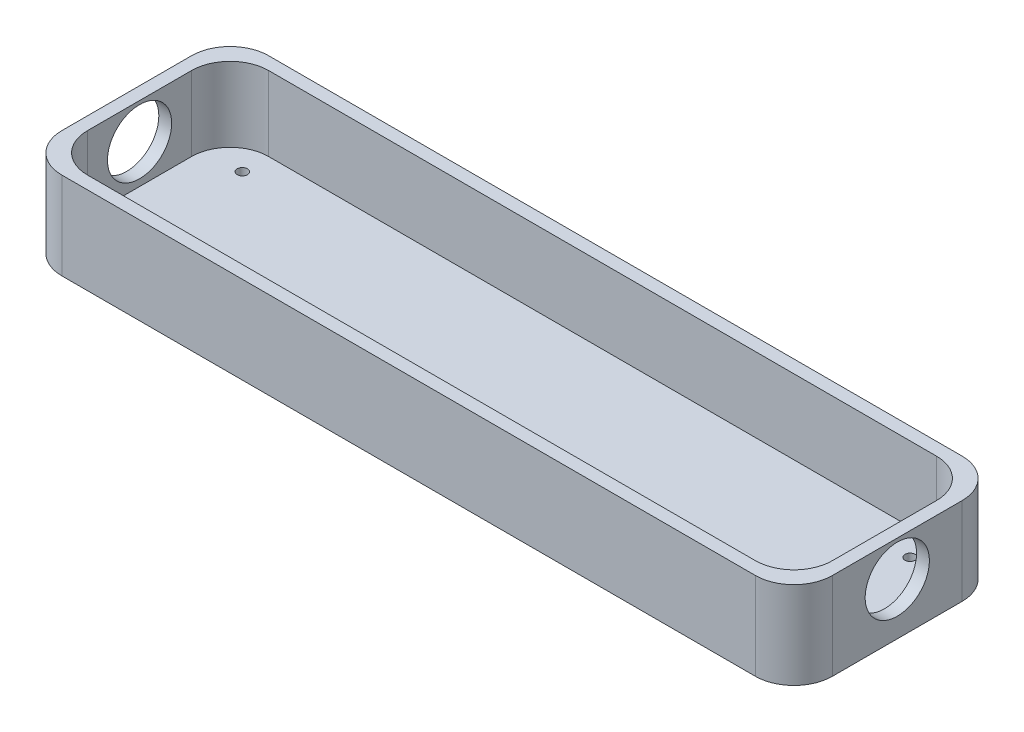
ISO-10303-21;
HEADER;
FILE_DESCRIPTION(('STEP AP214'),'2;1');
FILE_NAME('part.step','',(''),(''),'','','');
FILE_SCHEMA(('AUTOMOTIVE_DESIGN { 1 0 10303 214 1 1 1 1 }'));
ENDSEC;
DATA;
#1=APPLICATION_CONTEXT('core data for automotive mechanical design processes');
#2=APPLICATION_PROTOCOL_DEFINITION('international standard','automotive_design',2000,#1);
#3=PRODUCT_CONTEXT('',#1,'mechanical');
#4=PRODUCT('Part','Part','',(#3));
#5=PRODUCT_RELATED_PRODUCT_CATEGORY('part','',(#4));
#6=PRODUCT_DEFINITION_FORMATION('','',#4);
#7=PRODUCT_DEFINITION_CONTEXT('part definition',#1,'design');
#8=PRODUCT_DEFINITION('design','',#6,#7);
#9=PRODUCT_DEFINITION_SHAPE('','',#8);
#10=(LENGTH_UNIT() NAMED_UNIT(*) SI_UNIT(.MILLI.,.METRE.));
#11=(NAMED_UNIT(*) PLANE_ANGLE_UNIT() SI_UNIT($,.RADIAN.));
#12=(NAMED_UNIT(*) SI_UNIT($,.STERADIAN.) SOLID_ANGLE_UNIT());
#13=UNCERTAINTY_MEASURE_WITH_UNIT(LENGTH_MEASURE(1.E-05),#10,'distance_accuracy_value','');
#14=(GEOMETRIC_REPRESENTATION_CONTEXT(3) GLOBAL_UNCERTAINTY_ASSIGNED_CONTEXT((#13)) GLOBAL_UNIT_ASSIGNED_CONTEXT((#10,
#11,#12)) REPRESENTATION_CONTEXT('',''));
#15=CARTESIAN_POINT('',(0.,0.,0.));
#16=DIRECTION('',(0.,0.,1.));
#17=DIRECTION('',(1.,0.,0.));
#18=AXIS2_PLACEMENT_3D('',#15,#16,#17);
#19=CARTESIAN_POINT('',(130.,34.,20.25));
#20=DIRECTION('',(0.,-1.,0.));
#21=DIRECTION('',(0.,0.,-1.));
#22=AXIS2_PLACEMENT_3D('',#19,#20,#21);
#23=CYLINDRICAL_SURFACE('',#22,15.);
#24=DIRECTION('',(0.,1.,0.));
#25=VECTOR('',#24,1.);
#26=CARTESIAN_POINT('',(145.,34.,20.25));
#27=LINE('',#26,#25);
#28=CARTESIAN_POINT('',(145.,5.,20.25));
#29=VERTEX_POINT('',#28);
#30=CARTESIAN_POINT('',(145.,34.,20.25));
#31=VERTEX_POINT('',#30);
#32=EDGE_CURVE('E245',#29,#31,#27,.T.);
#33=ORIENTED_EDGE('',*,*,#32,.F.);
#34=CARTESIAN_POINT('',(130.,5.,20.25));
#35=DIRECTION('',(0.,1.,0.));
#36=DIRECTION('',(0.,0.,1.));
#37=AXIS2_PLACEMENT_3D('',#34,#35,#36);
#38=CIRCLE('',#37,15.);
#39=CARTESIAN_POINT('',(130.,5.,35.25));
#40=VERTEX_POINT('',#39);
#41=EDGE_CURVE('E40',#40,#29,#38,.T.);
#42=ORIENTED_EDGE('',*,*,#41,.F.);
#43=DIRECTION('',(0.,1.,0.));
#44=VECTOR('',#43,1.);
#45=CARTESIAN_POINT('',(130.,34.,35.25));
#46=LINE('',#45,#44);
#47=CARTESIAN_POINT('',(130.,34.,35.25));
#48=VERTEX_POINT('',#47);
#49=EDGE_CURVE('E248',#48,#40,#46,.F.);
#50=ORIENTED_EDGE('',*,*,#49,.F.);
#51=CARTESIAN_POINT('',(130.,34.,20.25));
#52=DIRECTION('',(0.,-1.,0.));
#53=DIRECTION('',(0.,0.,-1.));
#54=AXIS2_PLACEMENT_3D('',#51,#52,#53);
#55=CIRCLE('',#54,15.);
#56=EDGE_CURVE('E11',#48,#31,#55,.F.);
#57=ORIENTED_EDGE('',*,*,#56,.T.);
#58=EDGE_LOOP('',(#33,#42,#50,#57));
#59=FACE_BOUND('',#58,.T.);
#60=ADVANCED_FACE('F32',(#59),#23,.F.);
#61=CARTESIAN_POINT('',(130.,34.,-20.25));
#62=DIRECTION('',(0.,-1.,0.));
#63=DIRECTION('',(0.,0.,-1.));
#64=AXIS2_PLACEMENT_3D('',#61,#62,#63);
#65=CYLINDRICAL_SURFACE('',#64,15.);
#66=DIRECTION('',(0.,1.,0.));
#67=VECTOR('',#66,1.);
#68=CARTESIAN_POINT('',(130.,34.,-35.25));
#69=LINE('',#68,#67);
#70=CARTESIAN_POINT('',(130.,5.,-35.25));
#71=VERTEX_POINT('',#70);
#72=CARTESIAN_POINT('',(130.,34.,-35.25));
#73=VERTEX_POINT('',#72);
#74=EDGE_CURVE('E235',#71,#73,#69,.T.);
#75=ORIENTED_EDGE('',*,*,#74,.F.);
#76=CARTESIAN_POINT('',(130.,5.,-20.25));
#77=DIRECTION('',(0.,1.,0.));
#78=DIRECTION('',(0.,0.,1.));
#79=AXIS2_PLACEMENT_3D('',#76,#77,#78);
#80=CIRCLE('',#79,15.);
#81=CARTESIAN_POINT('',(145.,5.,-20.25));
#82=VERTEX_POINT('',#81);
#83=EDGE_CURVE('E241',#82,#71,#80,.T.);
#84=ORIENTED_EDGE('',*,*,#83,.F.);
#85=DIRECTION('',(0.,1.,0.));
#86=VECTOR('',#85,1.);
#87=CARTESIAN_POINT('',(145.,34.,-20.25));
#88=LINE('',#87,#86);
#89=CARTESIAN_POINT('',(145.,34.,-20.25));
#90=VERTEX_POINT('',#89);
#91=EDGE_CURVE('E238',#90,#82,#88,.F.);
#92=ORIENTED_EDGE('',*,*,#91,.F.);
#93=CARTESIAN_POINT('',(130.,34.,-20.25));
#94=DIRECTION('',(0.,-1.,0.));
#95=DIRECTION('',(0.,0.,-1.));
#96=AXIS2_PLACEMENT_3D('',#93,#94,#95);
#97=CIRCLE('',#96,15.);
#98=EDGE_CURVE('E243',#90,#73,#97,.F.);
#99=ORIENTED_EDGE('',*,*,#98,.T.);
#100=EDGE_LOOP('',(#75,#84,#92,#99));
#101=FACE_BOUND('',#100,.T.);
#102=ADVANCED_FACE('F339',(#101),#65,.F.);
#103=CARTESIAN_POINT('',(-130.,34.,20.25));
#104=DIRECTION('',(0.,-1.,0.));
#105=DIRECTION('',(0.,0.,-1.));
#106=AXIS2_PLACEMENT_3D('',#103,#104,#105);
#107=CYLINDRICAL_SURFACE('',#106,15.);
#108=DIRECTION('',(0.,1.,0.));
#109=VECTOR('',#108,1.);
#110=CARTESIAN_POINT('',(-130.,34.,35.25));
#111=LINE('',#110,#109);
#112=CARTESIAN_POINT('',(-130.,5.,35.25));
#113=VERTEX_POINT('',#112);
#114=CARTESIAN_POINT('',(-130.,34.,35.25));
#115=VERTEX_POINT('',#114);
#116=EDGE_CURVE('E225',#113,#115,#111,.T.);
#117=ORIENTED_EDGE('',*,*,#116,.F.);
#118=CARTESIAN_POINT('',(-130.,5.,20.25));
#119=DIRECTION('',(0.,1.,0.));
#120=DIRECTION('',(0.,0.,1.));
#121=AXIS2_PLACEMENT_3D('',#118,#119,#120);
#122=CIRCLE('',#121,15.);
#123=CARTESIAN_POINT('',(-145.,5.,20.25));
#124=VERTEX_POINT('',#123);
#125=EDGE_CURVE('E231',#124,#113,#122,.T.);
#126=ORIENTED_EDGE('',*,*,#125,.F.);
#127=DIRECTION('',(0.,1.,0.));
#128=VECTOR('',#127,1.);
#129=CARTESIAN_POINT('',(-145.,34.,20.25));
#130=LINE('',#129,#128);
#131=CARTESIAN_POINT('',(-145.,34.,20.25));
#132=VERTEX_POINT('',#131);
#133=EDGE_CURVE('E228',#132,#124,#130,.F.);
#134=ORIENTED_EDGE('',*,*,#133,.F.);
#135=CARTESIAN_POINT('',(-130.,34.,20.25));
#136=DIRECTION('',(0.,-1.,0.));
#137=DIRECTION('',(0.,0.,-1.));
#138=AXIS2_PLACEMENT_3D('',#135,#136,#137);
#139=CIRCLE('',#138,15.);
#140=EDGE_CURVE('E233',#132,#115,#139,.F.);
#141=ORIENTED_EDGE('',*,*,#140,.T.);
#142=EDGE_LOOP('',(#117,#126,#134,#141));
#143=FACE_BOUND('',#142,.T.);
#144=ADVANCED_FACE('F343',(#143),#107,.F.);
#145=CARTESIAN_POINT('',(-130.,34.,-20.25));
#146=DIRECTION('',(0.,1.,0.));
#147=DIRECTION('',(0.,0.,1.));
#148=AXIS2_PLACEMENT_3D('',#145,#146,#147);
#149=CYLINDRICAL_SURFACE('',#148,15.);
#150=DIRECTION('',(0.,-1.,0.));
#151=VECTOR('',#150,1.);
#152=CARTESIAN_POINT('',(-130.,34.,-35.25));
#153=LINE('',#152,#151);
#154=CARTESIAN_POINT('',(-130.,34.,-35.25));
#155=VERTEX_POINT('',#154);
#156=CARTESIAN_POINT('',(-130.,5.,-35.25));
#157=VERTEX_POINT('',#156);
#158=EDGE_CURVE('E214',#155,#157,#153,.T.);
#159=ORIENTED_EDGE('',*,*,#158,.F.);
#160=CARTESIAN_POINT('',(-130.,34.,-20.25));
#161=DIRECTION('',(0.,-1.,0.));
#162=DIRECTION('',(0.,0.,-1.));
#163=AXIS2_PLACEMENT_3D('',#160,#161,#162);
#164=CIRCLE('',#163,15.);
#165=CARTESIAN_POINT('',(-145.,34.,-20.25));
#166=VERTEX_POINT('',#165);
#167=EDGE_CURVE('E223',#155,#166,#164,.F.);
#168=ORIENTED_EDGE('',*,*,#167,.T.);
#169=DIRECTION('',(0.,-1.,0.));
#170=VECTOR('',#169,1.);
#171=CARTESIAN_POINT('',(-145.,34.,-20.25));
#172=LINE('',#171,#170);
#173=CARTESIAN_POINT('',(-145.,5.,-20.25));
#174=VERTEX_POINT('',#173);
#175=EDGE_CURVE('E217',#174,#166,#172,.F.);
#176=ORIENTED_EDGE('',*,*,#175,.F.);
#177=CARTESIAN_POINT('',(-130.,5.,-20.25));
#178=DIRECTION('',(0.,1.,0.));
#179=DIRECTION('',(0.,0.,1.));
#180=AXIS2_PLACEMENT_3D('',#177,#178,#179);
#181=CIRCLE('',#180,15.);
#182=EDGE_CURVE('E220',#157,#174,#181,.T.);
#183=ORIENTED_EDGE('',*,*,#182,.F.);
#184=EDGE_LOOP('',(#159,#168,#176,#183));
#185=FACE_BOUND('',#184,.T.);
#186=ADVANCED_FACE('F336',(#185),#149,.F.);
#187=CARTESIAN_POINT('',(135.,34.,25.25));
#188=DIRECTION('',(0.,-1.,0.));
#189=DIRECTION('',(0.,0.,-1.));
#190=AXIS2_PLACEMENT_3D('',#187,#188,#189);
#191=CYLINDRICAL_SURFACE('',#190,15.);
#192=DIRECTION('',(0.,-1.,0.));
#193=VECTOR('',#192,1.);
#194=CARTESIAN_POINT('',(150.,34.,25.25));
#195=LINE('',#194,#193);
#196=CARTESIAN_POINT('',(150.,34.,25.25));
#197=VERTEX_POINT('',#196);
#198=CARTESIAN_POINT('',(150.,0.,25.25));
#199=VERTEX_POINT('',#198);
#200=EDGE_CURVE('E206',#197,#199,#195,.T.);
#201=ORIENTED_EDGE('',*,*,#200,.F.);
#202=CARTESIAN_POINT('',(135.,34.,25.25));
#203=DIRECTION('',(0.,-1.,0.));
#204=DIRECTION('',(0.,0.,-1.));
#205=AXIS2_PLACEMENT_3D('',#202,#203,#204);
#206=CIRCLE('',#205,15.);
#207=CARTESIAN_POINT('',(135.,34.,40.25));
#208=VERTEX_POINT('',#207);
#209=EDGE_CURVE('E211',#208,#197,#206,.F.);
#210=ORIENTED_EDGE('',*,*,#209,.F.);
#211=DIRECTION('',(0.,-1.,0.));
#212=VECTOR('',#211,1.);
#213=CARTESIAN_POINT('',(135.,34.,40.25));
#214=LINE('',#213,#212);
#215=CARTESIAN_POINT('',(135.,0.,40.25));
#216=VERTEX_POINT('',#215);
#217=EDGE_CURVE('E209',#216,#208,#214,.F.);
#218=ORIENTED_EDGE('',*,*,#217,.F.);
#219=CARTESIAN_POINT('',(135.,0.,25.25));
#220=DIRECTION('',(0.,-1.,0.));
#221=DIRECTION('',(0.,0.,-1.));
#222=AXIS2_PLACEMENT_3D('',#219,#220,#221);
#223=CIRCLE('',#222,15.);
#224=EDGE_CURVE('E170',#199,#216,#223,.T.);
#225=ORIENTED_EDGE('',*,*,#224,.F.);
#226=EDGE_LOOP('',(#201,#210,#218,#225));
#227=FACE_BOUND('',#226,.T.);
#228=ADVANCED_FACE('F323',(#227),#191,.T.);
#229=CARTESIAN_POINT('',(135.,34.,-25.25));
#230=DIRECTION('',(0.,-1.,0.));
#231=DIRECTION('',(0.,0.,-1.));
#232=AXIS2_PLACEMENT_3D('',#229,#230,#231);
#233=CYLINDRICAL_SURFACE('',#232,15.);
#234=DIRECTION('',(0.,-1.,0.));
#235=VECTOR('',#234,1.);
#236=CARTESIAN_POINT('',(135.,34.,-40.25));
#237=LINE('',#236,#235);
#238=CARTESIAN_POINT('',(135.,34.,-40.25));
#239=VERTEX_POINT('',#238);
#240=CARTESIAN_POINT('',(135.,0.,-40.25));
#241=VERTEX_POINT('',#240);
#242=EDGE_CURVE('E195',#239,#241,#237,.T.);
#243=ORIENTED_EDGE('',*,*,#242,.F.);
#244=CARTESIAN_POINT('',(135.,34.,-25.25));
#245=DIRECTION('',(0.,-1.,0.));
#246=DIRECTION('',(0.,0.,-1.));
#247=AXIS2_PLACEMENT_3D('',#244,#245,#246);
#248=CIRCLE('',#247,15.);
#249=CARTESIAN_POINT('',(150.,34.,-25.25));
#250=VERTEX_POINT('',#249);
#251=EDGE_CURVE('E201',#250,#239,#248,.F.);
#252=ORIENTED_EDGE('',*,*,#251,.F.);
#253=DIRECTION('',(0.,-1.,0.));
#254=VECTOR('',#253,1.);
#255=CARTESIAN_POINT('',(150.,34.,-25.25));
#256=LINE('',#255,#254);
#257=CARTESIAN_POINT('',(150.,0.,-25.25));
#258=VERTEX_POINT('',#257);
#259=EDGE_CURVE('E198',#258,#250,#256,.F.);
#260=ORIENTED_EDGE('',*,*,#259,.F.);
#261=CARTESIAN_POINT('',(135.,0.,-25.25));
#262=DIRECTION('',(0.,-1.,0.));
#263=DIRECTION('',(0.,0.,-1.));
#264=AXIS2_PLACEMENT_3D('',#261,#262,#263);
#265=CIRCLE('',#264,15.);
#266=EDGE_CURVE('E203',#241,#258,#265,.T.);
#267=ORIENTED_EDGE('',*,*,#266,.F.);
#268=EDGE_LOOP('',(#243,#252,#260,#267));
#269=FACE_BOUND('',#268,.T.);
#270=ADVANCED_FACE('F328',(#269),#233,.T.);
#271=CARTESIAN_POINT('',(-135.,34.,-25.25));
#272=DIRECTION('',(0.,-1.,0.));
#273=DIRECTION('',(0.,0.,-1.));
#274=AXIS2_PLACEMENT_3D('',#271,#272,#273);
#275=CYLINDRICAL_SURFACE('',#274,15.);
#276=DIRECTION('',(0.,-1.,0.));
#277=VECTOR('',#276,1.);
#278=CARTESIAN_POINT('',(-150.,34.,-25.25));
#279=LINE('',#278,#277);
#280=CARTESIAN_POINT('',(-150.,34.,-25.25));
#281=VERTEX_POINT('',#280);
#282=CARTESIAN_POINT('',(-150.,0.,-25.25));
#283=VERTEX_POINT('',#282);
#284=EDGE_CURVE('E156',#281,#283,#279,.T.);
#285=ORIENTED_EDGE('',*,*,#284,.F.);
#286=CARTESIAN_POINT('',(-135.,34.,-25.25));
#287=DIRECTION('',(0.,-1.,0.));
#288=DIRECTION('',(0.,0.,-1.));
#289=AXIS2_PLACEMENT_3D('',#286,#287,#288);
#290=CIRCLE('',#289,15.);
#291=CARTESIAN_POINT('',(-135.,34.,-40.25));
#292=VERTEX_POINT('',#291);
#293=EDGE_CURVE('E190',#292,#281,#290,.F.);
#294=ORIENTED_EDGE('',*,*,#293,.F.);
#295=DIRECTION('',(0.,-1.,0.));
#296=VECTOR('',#295,1.);
#297=CARTESIAN_POINT('',(-135.,34.,-40.25));
#298=LINE('',#297,#296);
#299=CARTESIAN_POINT('',(-135.,0.,-40.25));
#300=VERTEX_POINT('',#299);
#301=EDGE_CURVE('E187',#300,#292,#298,.F.);
#302=ORIENTED_EDGE('',*,*,#301,.F.);
#303=CARTESIAN_POINT('',(-135.,0.,-25.25));
#304=DIRECTION('',(0.,-1.,0.));
#305=DIRECTION('',(0.,0.,-1.));
#306=AXIS2_PLACEMENT_3D('',#303,#304,#305);
#307=CIRCLE('',#306,15.);
#308=EDGE_CURVE('E192',#283,#300,#307,.T.);
#309=ORIENTED_EDGE('',*,*,#308,.F.);
#310=EDGE_LOOP('',(#285,#294,#302,#309));
#311=FACE_BOUND('',#310,.T.);
#312=ADVANCED_FACE('F314',(#311),#275,.T.);
#313=CARTESIAN_POINT('',(-135.,34.,25.25));
#314=DIRECTION('',(0.,-1.,0.));
#315=DIRECTION('',(0.,0.,-1.));
#316=AXIS2_PLACEMENT_3D('',#313,#314,#315);
#317=CYLINDRICAL_SURFACE('',#316,15.);
#318=DIRECTION('',(0.,-1.,0.));
#319=VECTOR('',#318,1.);
#320=CARTESIAN_POINT('',(-135.,34.,40.25));
#321=LINE('',#320,#319);
#322=CARTESIAN_POINT('',(-135.,34.,40.25));
#323=VERTEX_POINT('',#322);
#324=CARTESIAN_POINT('',(-135.,0.,40.25));
#325=VERTEX_POINT('',#324);
#326=EDGE_CURVE('E149',#323,#325,#321,.T.);
#327=ORIENTED_EDGE('',*,*,#326,.F.);
#328=CARTESIAN_POINT('',(-135.,34.,25.25));
#329=DIRECTION('',(0.,-1.,0.));
#330=DIRECTION('',(0.,0.,-1.));
#331=AXIS2_PLACEMENT_3D('',#328,#329,#330);
#332=CIRCLE('',#331,15.);
#333=CARTESIAN_POINT('',(-150.,34.,25.25));
#334=VERTEX_POINT('',#333);
#335=EDGE_CURVE('E157',#334,#323,#332,.F.);
#336=ORIENTED_EDGE('',*,*,#335,.F.);
#337=DIRECTION('',(0.,-1.,0.));
#338=VECTOR('',#337,1.);
#339=CARTESIAN_POINT('',(-150.,34.,25.25));
#340=LINE('',#339,#338);
#341=CARTESIAN_POINT('',(-150.,0.,25.25));
#342=VERTEX_POINT('',#341);
#343=EDGE_CURVE('E152',#342,#334,#340,.F.);
#344=ORIENTED_EDGE('',*,*,#343,.F.);
#345=CARTESIAN_POINT('',(-135.,0.,25.25));
#346=DIRECTION('',(0.,-1.,0.));
#347=DIRECTION('',(0.,0.,-1.));
#348=AXIS2_PLACEMENT_3D('',#345,#346,#347);
#349=CIRCLE('',#348,15.);
#350=EDGE_CURVE('E145',#325,#342,#349,.T.);
#351=ORIENTED_EDGE('',*,*,#350,.F.);
#352=EDGE_LOOP('',(#327,#336,#344,#351));
#353=FACE_BOUND('',#352,.T.);
#354=ADVANCED_FACE('F147',(#353),#317,.T.);
#355=CARTESIAN_POINT('',(0.,34.,0.));
#356=DIRECTION('',(0.,-1.,0.));
#357=DIRECTION('',(0.,0.,-1.));
#358=AXIS2_PLACEMENT_3D('',#355,#356,#357);
#359=PLANE('',#358);
#360=DIRECTION('',(1.,0.,0.));
#361=VECTOR('',#360,1.);
#362=CARTESIAN_POINT('',(-150.,34.,40.25));
#363=LINE('',#362,#361);
#364=EDGE_CURVE('E165',#323,#208,#363,.T.);
#365=ORIENTED_EDGE('',*,*,#364,.T.);
#366=ORIENTED_EDGE('',*,*,#209,.T.);
#367=DIRECTION('',(0.,0.,-1.));
#368=VECTOR('',#367,1.);
#369=CARTESIAN_POINT('',(150.,34.,40.25));
#370=LINE('',#369,#368);
#371=EDGE_CURVE('E303',#197,#250,#370,.T.);
#372=ORIENTED_EDGE('',*,*,#371,.T.);
#373=ORIENTED_EDGE('',*,*,#251,.T.);
#374=DIRECTION('',(-1.,0.,0.));
#375=VECTOR('',#374,1.);
#376=CARTESIAN_POINT('',(-150.,34.,-40.25));
#377=LINE('',#376,#375);
#378=EDGE_CURVE('E166',#239,#292,#377,.T.);
#379=ORIENTED_EDGE('',*,*,#378,.T.);
#380=ORIENTED_EDGE('',*,*,#293,.T.);
#381=DIRECTION('',(0.,0.,1.));
#382=VECTOR('',#381,1.);
#383=CARTESIAN_POINT('',(-150.,34.,40.25));
#384=LINE('',#383,#382);
#385=EDGE_CURVE('E181',#281,#334,#384,.T.);
#386=ORIENTED_EDGE('',*,*,#385,.T.);
#387=ORIENTED_EDGE('',*,*,#335,.T.);
#388=EDGE_LOOP('',(#365,#366,#372,#373,#379,#380,#386,#387));
#389=FACE_BOUND('',#388,.T.);
#390=DIRECTION('',(1.,0.,0.));
#391=VECTOR('',#390,1.);
#392=CARTESIAN_POINT('',(-145.,34.,35.25));
#393=LINE('',#392,#391);
#394=EDGE_CURVE('E292',#115,#48,#393,.T.);
#395=ORIENTED_EDGE('',*,*,#394,.F.);
#396=ORIENTED_EDGE('',*,*,#140,.F.);
#397=DIRECTION('',(0.,0.,1.));
#398=VECTOR('',#397,1.);
#399=CARTESIAN_POINT('',(-145.,34.,35.25));
#400=LINE('',#399,#398);
#401=EDGE_CURVE('E177',#166,#132,#400,.T.);
#402=ORIENTED_EDGE('',*,*,#401,.F.);
#403=ORIENTED_EDGE('',*,*,#167,.F.);
#404=DIRECTION('',(-1.,0.,0.));
#405=VECTOR('',#404,1.);
#406=CARTESIAN_POINT('',(-145.,34.,-35.25));
#407=LINE('',#406,#405);
#408=EDGE_CURVE('E297',#73,#155,#407,.T.);
#409=ORIENTED_EDGE('',*,*,#408,.F.);
#410=ORIENTED_EDGE('',*,*,#98,.F.);
#411=DIRECTION('',(0.,0.,-1.));
#412=VECTOR('',#411,1.);
#413=CARTESIAN_POINT('',(145.,34.,35.25));
#414=LINE('',#413,#412);
#415=EDGE_CURVE('E295',#31,#90,#414,.T.);
#416=ORIENTED_EDGE('',*,*,#415,.F.);
#417=ORIENTED_EDGE('',*,*,#56,.F.);
#418=EDGE_LOOP('',(#395,#396,#402,#403,#409,#410,#416,#417));
#419=FACE_BOUND('',#418,.T.);
#420=ADVANCED_FACE('F307',(#389,#419),#359,.F.);
#421=CARTESIAN_POINT('',(0.,0.,0.));
#422=DIRECTION('',(0.,-1.,0.));
#423=DIRECTION('',(0.,0.,-1.));
#424=AXIS2_PLACEMENT_3D('',#421,#422,#423);
#425=PLANE('',#424);
#426=CARTESIAN_POINT('',(-130.,0.,-25.));
#427=DIRECTION('',(0.,-1.,0.));
#428=DIRECTION('',(0.,0.,1.));
#429=AXIS2_PLACEMENT_3D('',#426,#427,#428);
#430=CIRCLE('',#429,2.);
#431=CARTESIAN_POINT('',(-130.,0.,-23.));
#432=VERTEX_POINT('',#431);
#433=EDGE_CURVE('E265',#432,#432,#430,.T.);
#434=ORIENTED_EDGE('',*,*,#433,.F.);
#435=EDGE_LOOP('',(#434));
#436=FACE_BOUND('',#435,.T.);
#437=CARTESIAN_POINT('',(-130.,0.,25.));
#438=DIRECTION('',(0.,1.,0.));
#439=DIRECTION('',(0.,0.,-1.));
#440=AXIS2_PLACEMENT_3D('',#437,#438,#439);
#441=CIRCLE('',#440,2.);
#442=CARTESIAN_POINT('',(-130.,0.,23.));
#443=VERTEX_POINT('',#442);
#444=EDGE_CURVE('E262',#443,#443,#441,.T.);
#445=ORIENTED_EDGE('',*,*,#444,.T.);
#446=EDGE_LOOP('',(#445));
#447=FACE_BOUND('',#446,.T.);
#448=CARTESIAN_POINT('',(130.,0.,-25.));
#449=DIRECTION('',(0.,1.,0.));
#450=DIRECTION('',(0.,0.,1.));
#451=AXIS2_PLACEMENT_3D('',#448,#449,#450);
#452=CIRCLE('',#451,2.);
#453=CARTESIAN_POINT('',(130.,0.,-23.));
#454=VERTEX_POINT('',#453);
#455=EDGE_CURVE('E259',#454,#454,#452,.T.);
#456=ORIENTED_EDGE('',*,*,#455,.T.);
#457=EDGE_LOOP('',(#456));
#458=FACE_BOUND('',#457,.T.);
#459=CARTESIAN_POINT('',(130.,0.,25.));
#460=DIRECTION('',(0.,-1.,0.));
#461=DIRECTION('',(0.,0.,-1.));
#462=AXIS2_PLACEMENT_3D('',#459,#460,#461);
#463=CIRCLE('',#462,2.);
#464=CARTESIAN_POINT('',(130.,0.,23.));
#465=VERTEX_POINT('',#464);
#466=EDGE_CURVE('E255',#465,#465,#463,.T.);
#467=ORIENTED_EDGE('',*,*,#466,.F.);
#468=EDGE_LOOP('',(#467));
#469=FACE_BOUND('',#468,.T.);
#470=DIRECTION('',(0.,0.,-1.));
#471=VECTOR('',#470,1.);
#472=CARTESIAN_POINT('',(150.,0.,40.25));
#473=LINE('',#472,#471);
#474=EDGE_CURVE('E172',#199,#258,#473,.T.);
#475=ORIENTED_EDGE('',*,*,#474,.F.);
#476=ORIENTED_EDGE('',*,*,#224,.T.);
#477=DIRECTION('',(1.,0.,0.));
#478=VECTOR('',#477,1.);
#479=CARTESIAN_POINT('',(-150.,0.,40.25));
#480=LINE('',#479,#478);
#481=EDGE_CURVE('E163',#325,#216,#480,.T.);
#482=ORIENTED_EDGE('',*,*,#481,.F.);
#483=ORIENTED_EDGE('',*,*,#350,.T.);
#484=DIRECTION('',(0.,0.,1.));
#485=VECTOR('',#484,1.);
#486=CARTESIAN_POINT('',(-150.,0.,40.25));
#487=LINE('',#486,#485);
#488=EDGE_CURVE('E173',#283,#342,#487,.T.);
#489=ORIENTED_EDGE('',*,*,#488,.F.);
#490=ORIENTED_EDGE('',*,*,#308,.T.);
#491=DIRECTION('',(-1.,0.,0.));
#492=VECTOR('',#491,1.);
#493=CARTESIAN_POINT('',(-150.,0.,-40.25));
#494=LINE('',#493,#492);
#495=EDGE_CURVE('E175',#241,#300,#494,.T.);
#496=ORIENTED_EDGE('',*,*,#495,.F.);
#497=ORIENTED_EDGE('',*,*,#266,.T.);
#498=EDGE_LOOP('',(#475,#476,#482,#483,#489,#490,#496,#497));
#499=FACE_BOUND('',#498,.T.);
#500=ADVANCED_FACE('F169',(#436,#447,#458,#469,#499),#425,.T.);
#501=CARTESIAN_POINT('',(-150.,34.,40.25));
#502=DIRECTION('',(1.,0.,0.));
#503=DIRECTION('',(0.,0.,-1.));
#504=AXIS2_PLACEMENT_3D('',#501,#502,#503);
#505=PLANE('',#504);
#506=CARTESIAN_POINT('',(-150.,20.125,0.));
#507=DIRECTION('',(1.,0.,0.));
#508=DIRECTION('',(0.,0.,-1.));
#509=AXIS2_PLACEMENT_3D('',#506,#507,#508);
#510=CIRCLE('',#509,12.5);
#511=CARTESIAN_POINT('',(-150.,20.125,-12.4999999999999));
#512=VERTEX_POINT('',#511);
#513=EDGE_CURVE('E575',#512,#512,#510,.T.);
#514=ORIENTED_EDGE('',*,*,#513,.T.);
#515=EDGE_LOOP('',(#514));
#516=FACE_BOUND('',#515,.T.);
#517=ORIENTED_EDGE('',*,*,#385,.F.);
#518=ORIENTED_EDGE('',*,*,#284,.T.);
#519=ORIENTED_EDGE('',*,*,#488,.T.);
#520=ORIENTED_EDGE('',*,*,#343,.T.);
#521=EDGE_LOOP('',(#517,#518,#519,#520));
#522=FACE_BOUND('',#521,.T.);
#523=ADVANCED_FACE('F319',(#516,#522),#505,.F.);
#524=CARTESIAN_POINT('',(-150.,34.,40.25));
#525=DIRECTION('',(0.,0.,-1.));
#526=DIRECTION('',(-1.,0.,0.));
#527=AXIS2_PLACEMENT_3D('',#524,#525,#526);
#528=PLANE('',#527);
#529=ORIENTED_EDGE('',*,*,#481,.T.);
#530=ORIENTED_EDGE('',*,*,#217,.T.);
#531=ORIENTED_EDGE('',*,*,#364,.F.);
#532=ORIENTED_EDGE('',*,*,#326,.T.);
#533=EDGE_LOOP('',(#529,#530,#531,#532));
#534=FACE_BOUND('',#533,.T.);
#535=ADVANCED_FACE('F161',(#534),#528,.F.);
#536=CARTESIAN_POINT('',(150.,34.,40.25));
#537=DIRECTION('',(-1.,0.,0.));
#538=DIRECTION('',(0.,0.,1.));
#539=AXIS2_PLACEMENT_3D('',#536,#537,#538);
#540=PLANE('',#539);
#541=CARTESIAN_POINT('',(150.,20.125,0.));
#542=DIRECTION('',(1.,0.,0.));
#543=DIRECTION('',(0.,0.,-1.));
#544=AXIS2_PLACEMENT_3D('',#541,#542,#543);
#545=CIRCLE('',#544,12.5);
#546=CARTESIAN_POINT('',(150.,20.125,-12.5));
#547=VERTEX_POINT('',#546);
#548=EDGE_CURVE('E577',#547,#547,#545,.T.);
#549=ORIENTED_EDGE('',*,*,#548,.F.);
#550=EDGE_LOOP('',(#549));
#551=FACE_BOUND('',#550,.T.);
#552=ORIENTED_EDGE('',*,*,#371,.F.);
#553=ORIENTED_EDGE('',*,*,#200,.T.);
#554=ORIENTED_EDGE('',*,*,#474,.T.);
#555=ORIENTED_EDGE('',*,*,#259,.T.);
#556=EDGE_LOOP('',(#552,#553,#554,#555));
#557=FACE_BOUND('',#556,.T.);
#558=ADVANCED_FACE('F325',(#551,#557),#540,.F.);
#559=CARTESIAN_POINT('',(-150.,34.,-40.25));
#560=DIRECTION('',(0.,0.,1.));
#561=DIRECTION('',(1.,0.,0.));
#562=AXIS2_PLACEMENT_3D('',#559,#560,#561);
#563=PLANE('',#562);
#564=ORIENTED_EDGE('',*,*,#378,.F.);
#565=ORIENTED_EDGE('',*,*,#242,.T.);
#566=ORIENTED_EDGE('',*,*,#495,.T.);
#567=ORIENTED_EDGE('',*,*,#301,.T.);
#568=EDGE_LOOP('',(#564,#565,#566,#567));
#569=FACE_BOUND('',#568,.T.);
#570=ADVANCED_FACE('F316',(#569),#563,.F.);
#571=CARTESIAN_POINT('',(-145.,34.,35.25));
#572=DIRECTION('',(0.,0.,-1.));
#573=DIRECTION('',(-1.,0.,0.));
#574=AXIS2_PLACEMENT_3D('',#571,#572,#573);
#575=PLANE('',#574);
#576=ORIENTED_EDGE('',*,*,#394,.T.);
#577=ORIENTED_EDGE('',*,*,#49,.T.);
#578=DIRECTION('',(1.,0.,0.));
#579=VECTOR('',#578,1.);
#580=CARTESIAN_POINT('',(0.,5.,35.25));
#581=LINE('',#580,#579);
#582=EDGE_CURVE('E284',#113,#40,#581,.T.);
#583=ORIENTED_EDGE('',*,*,#582,.F.);
#584=ORIENTED_EDGE('',*,*,#116,.T.);
#585=EDGE_LOOP('',(#576,#577,#583,#584));
#586=FACE_BOUND('',#585,.T.);
#587=ADVANCED_FACE('F371',(#586),#575,.T.);
#588=CARTESIAN_POINT('',(145.,34.,35.25));
#589=DIRECTION('',(-1.,0.,0.));
#590=DIRECTION('',(0.,0.,1.));
#591=AXIS2_PLACEMENT_3D('',#588,#589,#590);
#592=PLANE('',#591);
#593=CARTESIAN_POINT('',(145.,20.125,0.));
#594=DIRECTION('',(-1.,0.,0.));
#595=DIRECTION('',(0.,0.,1.));
#596=AXIS2_PLACEMENT_3D('',#593,#594,#595);
#597=CIRCLE('',#596,12.5);
#598=CARTESIAN_POINT('',(145.,20.125,12.5));
#599=VERTEX_POINT('',#598);
#600=EDGE_CURVE('E271',#599,#599,#597,.T.);
#601=ORIENTED_EDGE('',*,*,#600,.F.);
#602=EDGE_LOOP('',(#601));
#603=FACE_BOUND('',#602,.T.);
#604=DIRECTION('',(0.,0.,-1.));
#605=VECTOR('',#604,1.);
#606=CARTESIAN_POINT('',(145.,5.,0.));
#607=LINE('',#606,#605);
#608=EDGE_CURVE('E287',#29,#82,#607,.T.);
#609=ORIENTED_EDGE('',*,*,#608,.F.);
#610=ORIENTED_EDGE('',*,*,#32,.T.);
#611=ORIENTED_EDGE('',*,*,#415,.T.);
#612=ORIENTED_EDGE('',*,*,#91,.T.);
#613=EDGE_LOOP('',(#609,#610,#611,#612));
#614=FACE_BOUND('',#613,.T.);
#615=ADVANCED_FACE('F347',(#603,#614),#592,.T.);
#616=CARTESIAN_POINT('',(-145.,34.,-35.25));
#617=DIRECTION('',(0.,0.,1.));
#618=DIRECTION('',(1.,0.,0.));
#619=AXIS2_PLACEMENT_3D('',#616,#617,#618);
#620=PLANE('',#619);
#621=DIRECTION('',(1.,0.,0.));
#622=VECTOR('',#621,1.);
#623=CARTESIAN_POINT('',(0.,5.,-35.25));
#624=LINE('',#623,#622);
#625=EDGE_CURVE('E289',#157,#71,#624,.T.);
#626=ORIENTED_EDGE('',*,*,#625,.T.);
#627=ORIENTED_EDGE('',*,*,#74,.T.);
#628=ORIENTED_EDGE('',*,*,#408,.T.);
#629=ORIENTED_EDGE('',*,*,#158,.T.);
#630=EDGE_LOOP('',(#626,#627,#628,#629));
#631=FACE_BOUND('',#630,.T.);
#632=ADVANCED_FACE('F357',(#631),#620,.T.);
#633=CARTESIAN_POINT('',(-145.,34.,35.25));
#634=DIRECTION('',(1.,0.,0.));
#635=DIRECTION('',(0.,0.,-1.));
#636=AXIS2_PLACEMENT_3D('',#633,#634,#635);
#637=PLANE('',#636);
#638=CARTESIAN_POINT('',(-145.,20.125,0.));
#639=DIRECTION('',(1.,0.,0.));
#640=DIRECTION('',(0.,0.,-1.));
#641=AXIS2_PLACEMENT_3D('',#638,#639,#640);
#642=CIRCLE('',#641,12.5);
#643=CARTESIAN_POINT('',(-145.,20.125,-12.4999999999999));
#644=VERTEX_POINT('',#643);
#645=EDGE_CURVE('E35',#644,#644,#642,.T.);
#646=ORIENTED_EDGE('',*,*,#645,.F.);
#647=EDGE_LOOP('',(#646));
#648=FACE_BOUND('',#647,.T.);
#649=ORIENTED_EDGE('',*,*,#401,.T.);
#650=ORIENTED_EDGE('',*,*,#133,.T.);
#651=DIRECTION('',(0.,0.,-1.));
#652=VECTOR('',#651,1.);
#653=CARTESIAN_POINT('',(-145.,5.,0.));
#654=LINE('',#653,#652);
#655=EDGE_CURVE('E254',#124,#174,#654,.T.);
#656=ORIENTED_EDGE('',*,*,#655,.T.);
#657=ORIENTED_EDGE('',*,*,#175,.T.);
#658=EDGE_LOOP('',(#649,#650,#656,#657));
#659=FACE_BOUND('',#658,.T.);
#660=ADVANCED_FACE('F365',(#648,#659),#637,.T.);
#661=CARTESIAN_POINT('',(0.,5.,0.));
#662=DIRECTION('',(0.,1.,0.));
#663=DIRECTION('',(0.,0.,1.));
#664=AXIS2_PLACEMENT_3D('',#661,#662,#663);
#665=PLANE('',#664);
#666=CARTESIAN_POINT('',(-130.,5.,-25.));
#667=DIRECTION('',(0.,1.,0.));
#668=DIRECTION('',(0.,0.,1.));
#669=AXIS2_PLACEMENT_3D('',#666,#667,#668);
#670=CIRCLE('',#669,2.);
#671=CARTESIAN_POINT('',(-130.,5.,-23.));
#672=VERTEX_POINT('',#671);
#673=EDGE_CURVE('E263',#672,#672,#670,.T.);
#674=ORIENTED_EDGE('',*,*,#673,.F.);
#675=EDGE_LOOP('',(#674));
#676=FACE_BOUND('',#675,.T.);
#677=CARTESIAN_POINT('',(-130.,5.,25.));
#678=DIRECTION('',(0.,1.,0.));
#679=DIRECTION('',(0.,0.,1.));
#680=AXIS2_PLACEMENT_3D('',#677,#678,#679);
#681=CIRCLE('',#680,2.);
#682=CARTESIAN_POINT('',(-130.,5.,27.));
#683=VERTEX_POINT('',#682);
#684=EDGE_CURVE('E260',#683,#683,#681,.F.);
#685=ORIENTED_EDGE('',*,*,#684,.T.);
#686=EDGE_LOOP('',(#685));
#687=FACE_BOUND('',#686,.T.);
#688=CARTESIAN_POINT('',(130.,5.,-25.));
#689=DIRECTION('',(0.,1.,0.));
#690=DIRECTION('',(0.,0.,1.));
#691=AXIS2_PLACEMENT_3D('',#688,#689,#690);
#692=CIRCLE('',#691,2.);
#693=CARTESIAN_POINT('',(130.,5.,-23.));
#694=VERTEX_POINT('',#693);
#695=EDGE_CURVE('E256',#694,#694,#692,.F.);
#696=ORIENTED_EDGE('',*,*,#695,.T.);
#697=EDGE_LOOP('',(#696));
#698=FACE_BOUND('',#697,.T.);
#699=CARTESIAN_POINT('',(130.,5.,25.));
#700=DIRECTION('',(0.,1.,0.));
#701=DIRECTION('',(0.,0.,1.));
#702=AXIS2_PLACEMENT_3D('',#699,#700,#701);
#703=CIRCLE('',#702,2.);
#704=CARTESIAN_POINT('',(130.,5.,27.));
#705=VERTEX_POINT('',#704);
#706=EDGE_CURVE('E251',#705,#705,#703,.T.);
#707=ORIENTED_EDGE('',*,*,#706,.F.);
#708=EDGE_LOOP('',(#707));
#709=FACE_BOUND('',#708,.T.);
#710=ORIENTED_EDGE('',*,*,#582,.T.);
#711=ORIENTED_EDGE('',*,*,#41,.T.);
#712=ORIENTED_EDGE('',*,*,#608,.T.);
#713=ORIENTED_EDGE('',*,*,#83,.T.);
#714=ORIENTED_EDGE('',*,*,#625,.F.);
#715=ORIENTED_EDGE('',*,*,#182,.T.);
#716=ORIENTED_EDGE('',*,*,#655,.F.);
#717=ORIENTED_EDGE('',*,*,#125,.T.);
#718=EDGE_LOOP('',(#710,#711,#712,#713,#714,#715,#716,#717));
#719=FACE_BOUND('',#718,.T.);
#720=ADVANCED_FACE('F351',(#676,#687,#698,#709,#719),#665,.T.);
#721=CARTESIAN_POINT('',(130.,34.,25.));
#722=DIRECTION('',(0.,-1.,0.));
#723=DIRECTION('',(0.,0.,-1.));
#724=AXIS2_PLACEMENT_3D('',#721,#722,#723);
#725=CYLINDRICAL_SURFACE('',#724,2.);
#726=ORIENTED_EDGE('',*,*,#706,.T.);
#727=EDGE_LOOP('',(#726));
#728=FACE_BOUND('',#727,.T.);
#729=ORIENTED_EDGE('',*,*,#466,.T.);
#730=EDGE_LOOP('',(#729));
#731=FACE_BOUND('',#730,.T.);
#732=ADVANCED_FACE('F475',(#728,#731),#725,.F.);
#733=CARTESIAN_POINT('',(130.,34.,-25.));
#734=DIRECTION('',(0.,-1.,0.));
#735=DIRECTION('',(0.,0.,-1.));
#736=AXIS2_PLACEMENT_3D('',#733,#734,#735);
#737=CYLINDRICAL_SURFACE('',#736,2.);
#738=ORIENTED_EDGE('',*,*,#695,.F.);
#739=EDGE_LOOP('',(#738));
#740=FACE_BOUND('',#739,.T.);
#741=ORIENTED_EDGE('',*,*,#455,.F.);
#742=EDGE_LOOP('',(#741));
#743=FACE_BOUND('',#742,.T.);
#744=ADVANCED_FACE('F481',(#740,#743),#737,.F.);
#745=CARTESIAN_POINT('',(-130.,34.,25.));
#746=DIRECTION('',(0.,-1.,0.));
#747=DIRECTION('',(0.,0.,-1.));
#748=AXIS2_PLACEMENT_3D('',#745,#746,#747);
#749=CYLINDRICAL_SURFACE('',#748,2.);
#750=ORIENTED_EDGE('',*,*,#684,.F.);
#751=EDGE_LOOP('',(#750));
#752=FACE_BOUND('',#751,.T.);
#753=ORIENTED_EDGE('',*,*,#444,.F.);
#754=EDGE_LOOP('',(#753));
#755=FACE_BOUND('',#754,.T.);
#756=ADVANCED_FACE('F489',(#752,#755),#749,.F.);
#757=CARTESIAN_POINT('',(-130.,34.,-25.));
#758=DIRECTION('',(0.,-1.,0.));
#759=DIRECTION('',(0.,0.,-1.));
#760=AXIS2_PLACEMENT_3D('',#757,#758,#759);
#761=CYLINDRICAL_SURFACE('',#760,2.);
#762=ORIENTED_EDGE('',*,*,#673,.T.);
#763=EDGE_LOOP('',(#762));
#764=FACE_BOUND('',#763,.T.);
#765=ORIENTED_EDGE('',*,*,#433,.T.);
#766=EDGE_LOOP('',(#765));
#767=FACE_BOUND('',#766,.T.);
#768=ADVANCED_FACE('F498',(#764,#767),#761,.F.);
#769=CARTESIAN_POINT('',(-150.,20.125,0.));
#770=DIRECTION('',(1.,0.,0.));
#771=DIRECTION('',(0.,0.,-1.));
#772=AXIS2_PLACEMENT_3D('',#769,#770,#771);
#773=CYLINDRICAL_SURFACE('',#772,12.5);
#774=ORIENTED_EDGE('',*,*,#645,.T.);
#775=EDGE_LOOP('',(#774));
#776=FACE_BOUND('',#775,.T.);
#777=ORIENTED_EDGE('',*,*,#513,.F.);
#778=EDGE_LOOP('',(#777));
#779=FACE_BOUND('',#778,.T.);
#780=ADVANCED_FACE('F506',(#776,#779),#773,.F.);
#781=ORIENTED_EDGE('',*,*,#600,.T.);
#782=EDGE_LOOP('',(#781));
#783=FACE_BOUND('',#782,.T.);
#784=ORIENTED_EDGE('',*,*,#548,.T.);
#785=EDGE_LOOP('',(#784));
#786=FACE_BOUND('',#785,.T.);
#787=ADVANCED_FACE('F514',(#783,#786),#773,.F.);
#788=CLOSED_SHELL('',(#60,#102,#144,#186,#228,#270,#312,#354,#420,#500,#523,#535,#558,#570,#587,
#615,#632,#660,#720,#732,#744,#756,#768,#780,#787));
#789=MANIFOLD_SOLID_BREP('B2',#788);
#790=ADVANCED_BREP_SHAPE_REPRESENTATION('',(#18,#789),#14);
#791=SHAPE_DEFINITION_REPRESENTATION(#9,#790);
ENDSEC;
END-ISO-10303-21;
